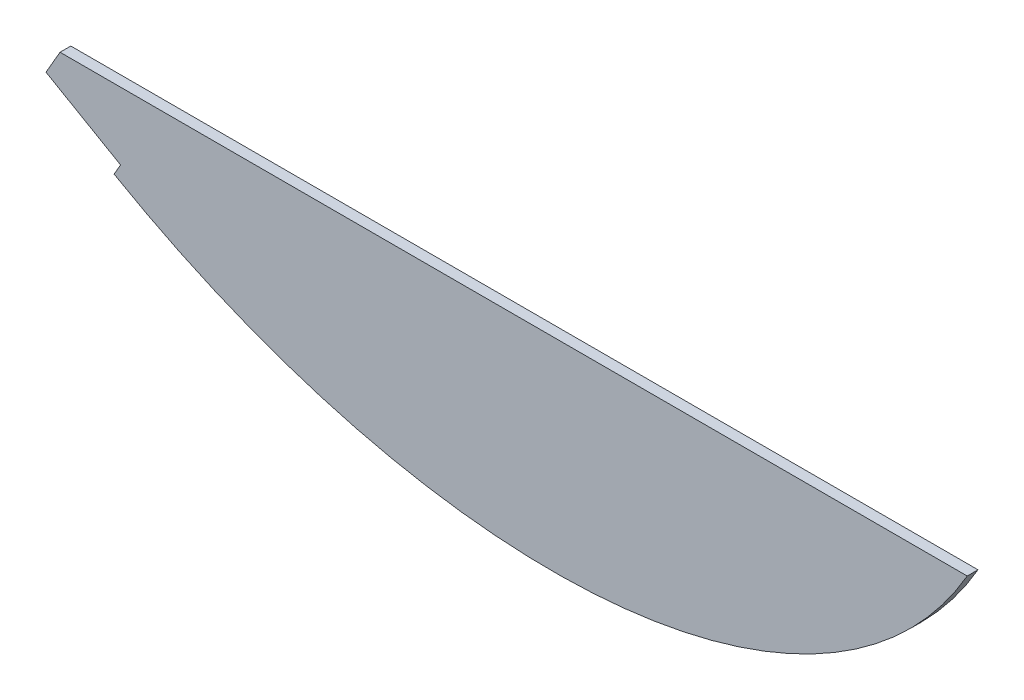
ISO-10303-21;
HEADER;
FILE_DESCRIPTION(('STEP AP214'),'2;1');
FILE_NAME('part.step','',(''),(''),'','','');
FILE_SCHEMA(('AUTOMOTIVE_DESIGN { 1 0 10303 214 1 1 1 1 }'));
ENDSEC;
DATA;
#1=APPLICATION_CONTEXT('core data for automotive mechanical design processes');
#2=APPLICATION_PROTOCOL_DEFINITION('international standard','automotive_design',2000,#1);
#3=PRODUCT_CONTEXT('',#1,'mechanical');
#4=PRODUCT('Part','Part','',(#3));
#5=PRODUCT_RELATED_PRODUCT_CATEGORY('part','',(#4));
#6=PRODUCT_DEFINITION_FORMATION('','',#4);
#7=PRODUCT_DEFINITION_CONTEXT('part definition',#1,'design');
#8=PRODUCT_DEFINITION('design','',#6,#7);
#9=PRODUCT_DEFINITION_SHAPE('','',#8);
#10=(LENGTH_UNIT() NAMED_UNIT(*) SI_UNIT(.MILLI.,.METRE.));
#11=(NAMED_UNIT(*) PLANE_ANGLE_UNIT() SI_UNIT($,.RADIAN.));
#12=(NAMED_UNIT(*) SI_UNIT($,.STERADIAN.) SOLID_ANGLE_UNIT());
#13=UNCERTAINTY_MEASURE_WITH_UNIT(LENGTH_MEASURE(1.E-05),#10,'distance_accuracy_value','');
#14=(GEOMETRIC_REPRESENTATION_CONTEXT(3) GLOBAL_UNCERTAINTY_ASSIGNED_CONTEXT((#13)) GLOBAL_UNIT_ASSIGNED_CONTEXT((#10,
#11,#12)) REPRESENTATION_CONTEXT('',''));
#15=CARTESIAN_POINT('',(0.,0.,0.));
#16=DIRECTION('',(0.,0.,1.));
#17=DIRECTION('',(1.,0.,0.));
#18=AXIS2_PLACEMENT_3D('',#15,#16,#17);
#19=CARTESIAN_POINT('',(0.,0.,5.));
#20=DIRECTION('',(0.,0.,1.));
#21=DIRECTION('',(1.,0.,0.));
#22=AXIS2_PLACEMENT_3D('',#19,#20,#21);
#23=PLANE('',#22);
#24=DIRECTION('',(0.499999999999991,0.866025403784444,0.));
#25=VECTOR('',#24,1.);
#26=CARTESIAN_POINT('',(-209.83890647083,-3.40279408891252,5.));
#27=LINE('',#26,#25);
#28=CARTESIAN_POINT('',(-209.83890647083,-3.40279408891252,5.));
#29=VERTEX_POINT('',#28);
#30=CARTESIAN_POINT('',(-206.83890647083,1.79335833379415,5.));
#31=VERTEX_POINT('',#30);
#32=EDGE_CURVE('E95',#29,#31,#27,.T.);
#33=ORIENTED_EDGE('',*,*,#32,.F.);
#34=CARTESIAN_POINT('',(-94.9435119545815,195.6018667689,5.));
#35=DIRECTION('',(0.,0.,-1.));
#36=DIRECTION('',(0.866025403784439,-0.5,0.));
#37=AXIS2_PLACEMENT_3D('',#34,#35,#36);
#38=ELLIPSE('',#37,325.024426661629,229.790789032496);
#39=CARTESIAN_POINT('',(186.535898384861,33.0896534380853,5.));
#40=VERTEX_POINT('',#39);
#41=EDGE_CURVE('E57',#40,#29,#38,.T.);
#42=ORIENTED_EDGE('',*,*,#41,.F.);
#43=DIRECTION('',(-1.,0.,0.));
#44=VECTOR('',#43,1.);
#45=CARTESIAN_POINT('',(-263.005679680131,33.0896534380854,5.));
#46=LINE('',#45,#44);
#47=CARTESIAN_POINT('',(-234.958003602899,33.0896534380853,5.));
#48=VERTEX_POINT('',#47);
#49=EDGE_CURVE('E41',#40,#48,#46,.T.);
#50=ORIENTED_EDGE('',*,*,#49,.T.);
#51=DIRECTION('',(-0.5,-0.866025403784439,0.));
#52=VECTOR('',#51,1.);
#53=CARTESIAN_POINT('',(-129.583845093257,215.603049781602,5.));
#54=LINE('',#53,#52);
#55=CARTESIAN_POINT('',(-241.479922622207,21.7933583337939,5.));
#56=VERTEX_POINT('',#55);
#57=EDGE_CURVE('E111',#48,#56,#54,.T.);
#58=ORIENTED_EDGE('',*,*,#57,.T.);
#59=DIRECTION('',(-0.866025403784439,0.5,0.));
#60=VECTOR('',#59,1.);
#61=CARTESIAN_POINT('',(-206.83890647083,1.79335833379415,5.));
#62=LINE('',#61,#60);
#63=EDGE_CURVE('E106',#31,#56,#62,.T.);
#64=ORIENTED_EDGE('',*,*,#63,.F.);
#65=EDGE_LOOP('',(#33,#42,#50,#58,#64));
#66=FACE_BOUND('',#65,.T.);
#67=ADVANCED_FACE('F33',(#66),#23,.T.);
#68=CARTESIAN_POINT('',(0.,0.,0.));
#69=DIRECTION('',(0.,0.,1.));
#70=DIRECTION('',(1.,0.,0.));
#71=AXIS2_PLACEMENT_3D('',#68,#69,#70);
#72=PLANE('',#71);
#73=CARTESIAN_POINT('',(-94.9435119545815,195.6018667689,0.));
#74=DIRECTION('',(0.,0.,-1.));
#75=DIRECTION('',(0.866025403784439,-0.5,0.));
#76=AXIS2_PLACEMENT_3D('',#73,#74,#75);
#77=ELLIPSE('',#76,325.024426661629,229.790789032496);
#78=CARTESIAN_POINT('',(186.535898384861,33.0896534380853,0.));
#79=VERTEX_POINT('',#78);
#80=CARTESIAN_POINT('',(-209.83890647083,-3.40279408891252,0.));
#81=VERTEX_POINT('',#80);
#82=EDGE_CURVE('E86',#79,#81,#77,.T.);
#83=ORIENTED_EDGE('',*,*,#82,.T.);
#84=DIRECTION('',(0.499999999999991,0.866025403784444,0.));
#85=VECTOR('',#84,1.);
#86=CARTESIAN_POINT('',(-209.83890647083,-3.40279408891252,0.));
#87=LINE('',#86,#85);
#88=CARTESIAN_POINT('',(-206.83890647083,1.79335833379415,0.));
#89=VERTEX_POINT('',#88);
#90=EDGE_CURVE('E108',#81,#89,#87,.T.);
#91=ORIENTED_EDGE('',*,*,#90,.T.);
#92=DIRECTION('',(-0.866025403784439,0.5,0.));
#93=VECTOR('',#92,1.);
#94=CARTESIAN_POINT('',(-206.83890647083,1.79335833379415,0.));
#95=LINE('',#94,#93);
#96=CARTESIAN_POINT('',(-241.479922622206,21.7933583337934,0.));
#97=VERTEX_POINT('',#96);
#98=EDGE_CURVE('E68',#89,#97,#95,.T.);
#99=ORIENTED_EDGE('',*,*,#98,.T.);
#100=DIRECTION('',(-0.5,-0.866025403784439,0.));
#101=VECTOR('',#100,1.);
#102=CARTESIAN_POINT('',(-129.583845093256,215.603049781601,0.));
#103=LINE('',#102,#101);
#104=CARTESIAN_POINT('',(-234.958003602898,33.0896534380854,0.));
#105=VERTEX_POINT('',#104);
#106=EDGE_CURVE('E48',#105,#97,#103,.T.);
#107=ORIENTED_EDGE('',*,*,#106,.F.);
#108=DIRECTION('',(-1.,0.,0.));
#109=VECTOR('',#108,1.);
#110=CARTESIAN_POINT('',(-263.005679680131,33.0896534380854,0.));
#111=LINE('',#110,#109);
#112=EDGE_CURVE('E99',#79,#105,#111,.T.);
#113=ORIENTED_EDGE('',*,*,#112,.F.);
#114=EDGE_LOOP('',(#83,#91,#99,#107,#113));
#115=FACE_BOUND('',#114,.T.);
#116=ADVANCED_FACE('F134',(#115),#72,.F.);
#117=CARTESIAN_POINT('',(-263.005679680131,33.0896534380854,5.));
#118=DIRECTION('',(0.,-1.,0.));
#119=DIRECTION('',(0.,0.,-1.));
#120=AXIS2_PLACEMENT_3D('',#117,#118,#119);
#121=PLANE('',#120);
#122=ORIENTED_EDGE('',*,*,#112,.T.);
#123=DIRECTION('',(2.36927033436852E-13,0.,-1.));
#124=VECTOR('',#123,1.);
#125=CARTESIAN_POINT('',(-234.958003602899,33.0896534380853,4.99999999997503));
#126=LINE('',#125,#124);
#127=EDGE_CURVE('E96',#48,#105,#126,.T.);
#128=ORIENTED_EDGE('',*,*,#127,.F.);
#129=ORIENTED_EDGE('',*,*,#49,.F.);
#130=DIRECTION('',(0.,0.,-1.));
#131=VECTOR('',#130,1.);
#132=CARTESIAN_POINT('',(186.535898384862,33.0896534380854,5.));
#133=LINE('',#132,#131);
#134=EDGE_CURVE('E11',#40,#79,#133,.T.);
#135=ORIENTED_EDGE('',*,*,#134,.T.);
#136=EDGE_LOOP('',(#122,#128,#129,#135));
#137=FACE_BOUND('',#136,.T.);
#138=ADVANCED_FACE('F35',(#137),#121,.F.);
#139=CARTESIAN_POINT('',(-206.83890647083,1.79335833379415,5.));
#140=DIRECTION('',(-0.5,-0.866025403784439,0.));
#141=DIRECTION('',(0.866025403784439,-0.5,0.));
#142=AXIS2_PLACEMENT_3D('',#139,#140,#141);
#143=PLANE('',#142);
#144=DIRECTION('',(-1.77635683940025E-13,1.02695629777827E-13,1.));
#145=VECTOR('',#144,1.);
#146=CARTESIAN_POINT('',(-241.479922622207,21.7933583337939,5.));
#147=LINE('',#146,#145);
#148=EDGE_CURVE('E72',#97,#56,#147,.T.);
#149=ORIENTED_EDGE('',*,*,#148,.F.);
#150=ORIENTED_EDGE('',*,*,#98,.F.);
#151=DIRECTION('',(0.,0.,-1.));
#152=VECTOR('',#151,1.);
#153=CARTESIAN_POINT('',(-206.83890647083,1.79335833379415,5.));
#154=LINE('',#153,#152);
#155=EDGE_CURVE('E101',#31,#89,#154,.T.);
#156=ORIENTED_EDGE('',*,*,#155,.F.);
#157=ORIENTED_EDGE('',*,*,#63,.T.);
#158=EDGE_LOOP('',(#149,#150,#156,#157));
#159=FACE_BOUND('',#158,.T.);
#160=ADVANCED_FACE('F127',(#159),#143,.T.);
#161=CARTESIAN_POINT('',(-209.83890647083,-3.40279408891252,5.));
#162=DIRECTION('',(-0.866025403784444,0.499999999999991,0.));
#163=DIRECTION('',(-0.499999999999991,-0.866025403784444,0.));
#164=AXIS2_PLACEMENT_3D('',#161,#162,#163);
#165=PLANE('',#164);
#166=ORIENTED_EDGE('',*,*,#90,.F.);
#167=DIRECTION('',(0.,0.,-1.));
#168=VECTOR('',#167,1.);
#169=CARTESIAN_POINT('',(-209.83890647083,-3.40279408891252,5.));
#170=LINE('',#169,#168);
#171=EDGE_CURVE('E104',#29,#81,#170,.T.);
#172=ORIENTED_EDGE('',*,*,#171,.F.);
#173=ORIENTED_EDGE('',*,*,#32,.T.);
#174=ORIENTED_EDGE('',*,*,#155,.T.);
#175=EDGE_LOOP('',(#166,#172,#173,#174));
#176=FACE_BOUND('',#175,.T.);
#177=ADVANCED_FACE('F126',(#176),#165,.T.);
#178=CARTESIAN_POINT('',(-129.583845093257,215.603049781602,5.));
#179=DIRECTION('',(0.866025403784439,-0.5,2.05184829799599E-13));
#180=DIRECTION('',(0.5,0.866025403784439,0.));
#181=AXIS2_PLACEMENT_3D('',#178,#179,#180);
#182=PLANE('',#181);
#183=ORIENTED_EDGE('',*,*,#127,.T.);
#184=ORIENTED_EDGE('',*,*,#106,.T.);
#185=ORIENTED_EDGE('',*,*,#148,.T.);
#186=ORIENTED_EDGE('',*,*,#57,.F.);
#187=EDGE_LOOP('',(#183,#184,#185,#186));
#188=FACE_BOUND('',#187,.T.);
#189=ADVANCED_FACE('F123',(#188),#182,.F.);
#190=DIRECTION('',(0.,0.,-1.));
#191=VECTOR('',#190,1.);
#192=SURFACE_OF_LINEAR_EXTRUSION('',#38,#191);
#193=ORIENTED_EDGE('',*,*,#82,.F.);
#194=ORIENTED_EDGE('',*,*,#134,.F.);
#195=ORIENTED_EDGE('',*,*,#41,.T.);
#196=ORIENTED_EDGE('',*,*,#171,.T.);
#197=EDGE_LOOP('',(#193,#194,#195,#196));
#198=FACE_BOUND('',#197,.T.);
#199=ADVANCED_FACE('F84',(#198),#192,.T.);
#200=CLOSED_SHELL('',(#67,#116,#138,#160,#177,#189,#199));
#201=MANIFOLD_SOLID_BREP('B2',#200);
#202=ADVANCED_BREP_SHAPE_REPRESENTATION('',(#18,#201),#14);
#203=SHAPE_DEFINITION_REPRESENTATION(#9,#202);
ENDSEC;
END-ISO-10303-21;
